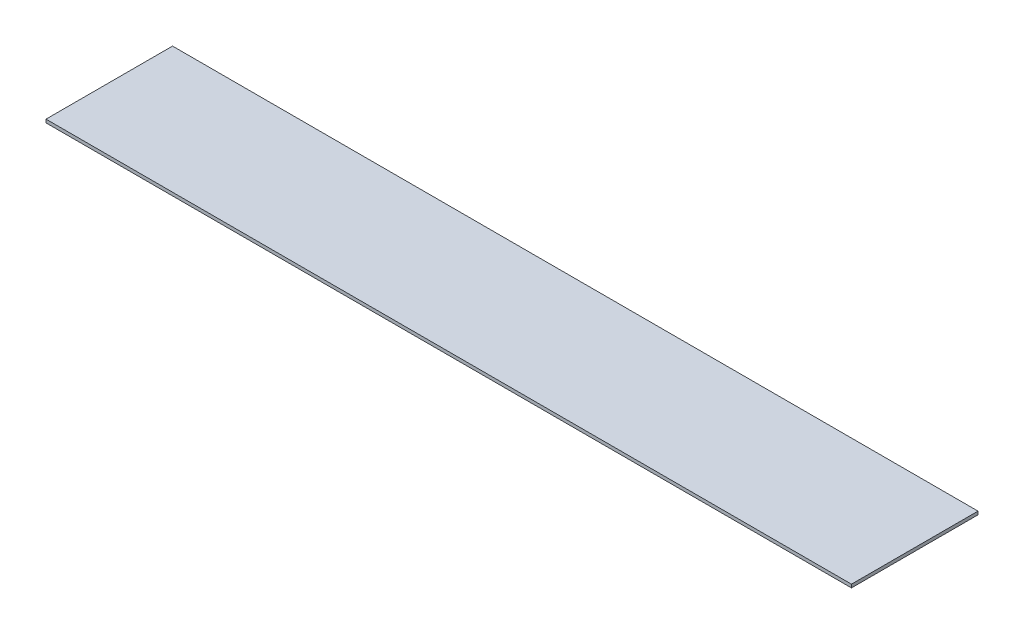
ISO-10303-21;
HEADER;
FILE_DESCRIPTION(('STEP AP214'),'2;1');
FILE_NAME('part.step','',(''),(''),'','','');
FILE_SCHEMA(('AUTOMOTIVE_DESIGN { 1 0 10303 214 1 1 1 1 }'));
ENDSEC;
DATA;
#1=APPLICATION_CONTEXT('core data for automotive mechanical design processes');
#2=APPLICATION_PROTOCOL_DEFINITION('international standard','automotive_design',2000,#1);
#3=PRODUCT_CONTEXT('',#1,'mechanical');
#4=PRODUCT('Part','Part','',(#3));
#5=PRODUCT_RELATED_PRODUCT_CATEGORY('part','',(#4));
#6=PRODUCT_DEFINITION_FORMATION('','',#4);
#7=PRODUCT_DEFINITION_CONTEXT('part definition',#1,'design');
#8=PRODUCT_DEFINITION('design','',#6,#7);
#9=PRODUCT_DEFINITION_SHAPE('','',#8);
#10=(LENGTH_UNIT() NAMED_UNIT(*) SI_UNIT(.MILLI.,.METRE.));
#11=(NAMED_UNIT(*) PLANE_ANGLE_UNIT() SI_UNIT($,.RADIAN.));
#12=(NAMED_UNIT(*) SI_UNIT($,.STERADIAN.) SOLID_ANGLE_UNIT());
#13=UNCERTAINTY_MEASURE_WITH_UNIT(LENGTH_MEASURE(1.E-05),#10,'distance_accuracy_value','');
#14=(GEOMETRIC_REPRESENTATION_CONTEXT(3) GLOBAL_UNCERTAINTY_ASSIGNED_CONTEXT((#13)) GLOBAL_UNIT_ASSIGNED_CONTEXT((#10,
#11,#12)) REPRESENTATION_CONTEXT('',''));
#15=CARTESIAN_POINT('',(0.,0.,0.));
#16=DIRECTION('',(0.,0.,1.));
#17=DIRECTION('',(1.,0.,0.));
#18=AXIS2_PLACEMENT_3D('',#15,#16,#17);
#19=CARTESIAN_POINT('',(-59.1289481870499,4.7625,-156.391847579448));
#20=DIRECTION('',(1.,0.,0.));
#21=DIRECTION('',(0.,0.,-1.));
#22=AXIS2_PLACEMENT_3D('',#19,#20,#21);
#23=PLANE('',#22);
#24=DIRECTION('',(0.,0.,1.));
#25=VECTOR('',#24,1.);
#26=CARTESIAN_POINT('',(-59.1289481870499,0.,-156.391847579448));
#27=LINE('',#26,#25);
#28=CARTESIAN_POINT('',(-59.1289481870499,0.,-156.391847579448));
#29=VERTEX_POINT('',#28);
#30=CARTESIAN_POINT('',(-59.1289481870498,0.,28.4005184205515));
#31=VERTEX_POINT('',#30);
#32=EDGE_CURVE('E98',#29,#31,#27,.T.);
#33=ORIENTED_EDGE('',*,*,#32,.T.);
#34=DIRECTION('',(0.,-1.,0.));
#35=VECTOR('',#34,1.);
#36=CARTESIAN_POINT('',(-59.1289481870498,4.7625,28.4005184205515));
#37=LINE('',#36,#35);
#38=CARTESIAN_POINT('',(-59.1289481870498,4.7625,28.4005184205515));
#39=VERTEX_POINT('',#38);
#40=EDGE_CURVE('E11',#39,#31,#37,.T.);
#41=ORIENTED_EDGE('',*,*,#40,.F.);
#42=DIRECTION('',(0.,0.,1.));
#43=VECTOR('',#42,1.);
#44=CARTESIAN_POINT('',(-59.1289481870499,4.7625,-156.391847579448));
#45=LINE('',#44,#43);
#46=CARTESIAN_POINT('',(-59.1289481870499,4.7625,-156.391847579448));
#47=VERTEX_POINT('',#46);
#48=EDGE_CURVE('E86',#47,#39,#45,.T.);
#49=ORIENTED_EDGE('',*,*,#48,.F.);
#50=DIRECTION('',(0.,-1.,0.));
#51=VECTOR('',#50,1.);
#52=CARTESIAN_POINT('',(-59.1289481870499,4.7625,-156.391847579448));
#53=LINE('',#52,#51);
#54=EDGE_CURVE('E94',#47,#29,#53,.T.);
#55=ORIENTED_EDGE('',*,*,#54,.T.);
#56=EDGE_LOOP('',(#33,#41,#49,#55));
#57=FACE_BOUND('',#56,.T.);
#58=ADVANCED_FACE('F35',(#57),#23,.F.);
#59=CARTESIAN_POINT('',(-59.1289481870498,4.7625,28.4005184205515));
#60=DIRECTION('',(0.,0.,-1.));
#61=DIRECTION('',(-1.,0.,0.));
#62=AXIS2_PLACEMENT_3D('',#59,#60,#61);
#63=PLANE('',#62);
#64=DIRECTION('',(1.,0.,0.));
#65=VECTOR('',#64,1.);
#66=CARTESIAN_POINT('',(-59.1289481870498,0.,28.4005184205515));
#67=LINE('',#66,#65);
#68=CARTESIAN_POINT('',(1117.14505181295,0.,28.4005184205515));
#69=VERTEX_POINT('',#68);
#70=EDGE_CURVE('E90',#31,#69,#67,.T.);
#71=ORIENTED_EDGE('',*,*,#70,.T.);
#72=DIRECTION('',(0.,-1.,0.));
#73=VECTOR('',#72,1.);
#74=CARTESIAN_POINT('',(1117.14505181295,4.7625,28.4005184205515));
#75=LINE('',#74,#73);
#76=CARTESIAN_POINT('',(1117.14505181295,4.7625,28.4005184205515));
#77=VERTEX_POINT('',#76);
#78=EDGE_CURVE('E43',#77,#69,#75,.T.);
#79=ORIENTED_EDGE('',*,*,#78,.F.);
#80=DIRECTION('',(1.,0.,0.));
#81=VECTOR('',#80,1.);
#82=CARTESIAN_POINT('',(-59.1289481870498,4.7625,28.4005184205515));
#83=LINE('',#82,#81);
#84=EDGE_CURVE('E81',#39,#77,#83,.T.);
#85=ORIENTED_EDGE('',*,*,#84,.F.);
#86=ORIENTED_EDGE('',*,*,#40,.T.);
#87=EDGE_LOOP('',(#71,#79,#85,#86));
#88=FACE_BOUND('',#87,.T.);
#89=ADVANCED_FACE('F89',(#88),#63,.F.);
#90=CARTESIAN_POINT('',(1117.14505181295,4.7625,-156.391847579448));
#91=DIRECTION('',(-1.,0.,0.));
#92=DIRECTION('',(0.,0.,1.));
#93=AXIS2_PLACEMENT_3D('',#90,#91,#92);
#94=PLANE('',#93);
#95=DIRECTION('',(0.,0.,-1.));
#96=VECTOR('',#95,1.);
#97=CARTESIAN_POINT('',(1117.14505181295,0.,-156.391847579448));
#98=LINE('',#97,#96);
#99=CARTESIAN_POINT('',(1117.14505181295,0.,-156.391847579448));
#100=VERTEX_POINT('',#99);
#101=EDGE_CURVE('E68',#69,#100,#98,.T.);
#102=ORIENTED_EDGE('',*,*,#101,.T.);
#103=DIRECTION('',(0.,-1.,0.));
#104=VECTOR('',#103,1.);
#105=CARTESIAN_POINT('',(1117.14505181295,4.7625,-156.391847579448));
#106=LINE('',#105,#104);
#107=CARTESIAN_POINT('',(1117.14505181295,4.7625,-156.391847579448));
#108=VERTEX_POINT('',#107);
#109=EDGE_CURVE('E91',#108,#100,#106,.T.);
#110=ORIENTED_EDGE('',*,*,#109,.F.);
#111=DIRECTION('',(0.,0.,-1.));
#112=VECTOR('',#111,1.);
#113=CARTESIAN_POINT('',(1117.14505181295,4.7625,-156.391847579448));
#114=LINE('',#113,#112);
#115=EDGE_CURVE('E84',#77,#108,#114,.T.);
#116=ORIENTED_EDGE('',*,*,#115,.F.);
#117=ORIENTED_EDGE('',*,*,#78,.T.);
#118=EDGE_LOOP('',(#102,#110,#116,#117));
#119=FACE_BOUND('',#118,.T.);
#120=ADVANCED_FACE('F92',(#119),#94,.F.);
#121=CARTESIAN_POINT('',(-59.1289481870499,4.7625,-156.391847579448));
#122=DIRECTION('',(0.,0.,1.));
#123=DIRECTION('',(1.,0.,0.));
#124=AXIS2_PLACEMENT_3D('',#121,#122,#123);
#125=PLANE('',#124);
#126=DIRECTION('',(-1.,0.,0.));
#127=VECTOR('',#126,1.);
#128=CARTESIAN_POINT('',(-59.1289481870499,0.,-156.391847579448));
#129=LINE('',#128,#127);
#130=EDGE_CURVE('E74',#100,#29,#129,.T.);
#131=ORIENTED_EDGE('',*,*,#130,.T.);
#132=ORIENTED_EDGE('',*,*,#54,.F.);
#133=DIRECTION('',(-1.,0.,0.));
#134=VECTOR('',#133,1.);
#135=CARTESIAN_POINT('',(-59.1289481870499,4.7625,-156.391847579448));
#136=LINE('',#135,#134);
#137=EDGE_CURVE('E51',#108,#47,#136,.T.);
#138=ORIENTED_EDGE('',*,*,#137,.F.);
#139=ORIENTED_EDGE('',*,*,#109,.T.);
#140=EDGE_LOOP('',(#131,#132,#138,#139));
#141=FACE_BOUND('',#140,.T.);
#142=ADVANCED_FACE('F105',(#141),#125,.F.);
#143=CARTESIAN_POINT('',(0.,4.7625,0.));
#144=DIRECTION('',(0.,1.,0.));
#145=DIRECTION('',(0.,0.,1.));
#146=AXIS2_PLACEMENT_3D('',#143,#144,#145);
#147=PLANE('',#146);
#148=ORIENTED_EDGE('',*,*,#48,.T.);
#149=ORIENTED_EDGE('',*,*,#84,.T.);
#150=ORIENTED_EDGE('',*,*,#115,.T.);
#151=ORIENTED_EDGE('',*,*,#137,.T.);
#152=EDGE_LOOP('',(#148,#149,#150,#151));
#153=FACE_BOUND('',#152,.T.);
#154=ADVANCED_FACE('F82',(#153),#147,.T.);
#155=CARTESIAN_POINT('',(0.,0.,0.));
#156=DIRECTION('',(0.,1.,0.));
#157=DIRECTION('',(0.,0.,1.));
#158=AXIS2_PLACEMENT_3D('',#155,#156,#157);
#159=PLANE('',#158);
#160=ORIENTED_EDGE('',*,*,#32,.F.);
#161=ORIENTED_EDGE('',*,*,#130,.F.);
#162=ORIENTED_EDGE('',*,*,#101,.F.);
#163=ORIENTED_EDGE('',*,*,#70,.F.);
#164=EDGE_LOOP('',(#160,#161,#162,#163));
#165=FACE_BOUND('',#164,.T.);
#166=ADVANCED_FACE('F108',(#165),#159,.F.);
#167=CLOSED_SHELL('',(#58,#89,#120,#142,#154,#166));
#168=MANIFOLD_SOLID_BREP('B2',#167);
#169=ADVANCED_BREP_SHAPE_REPRESENTATION('',(#18,#168),#14);
#170=SHAPE_DEFINITION_REPRESENTATION(#9,#169);
ENDSEC;
END-ISO-10303-21;
